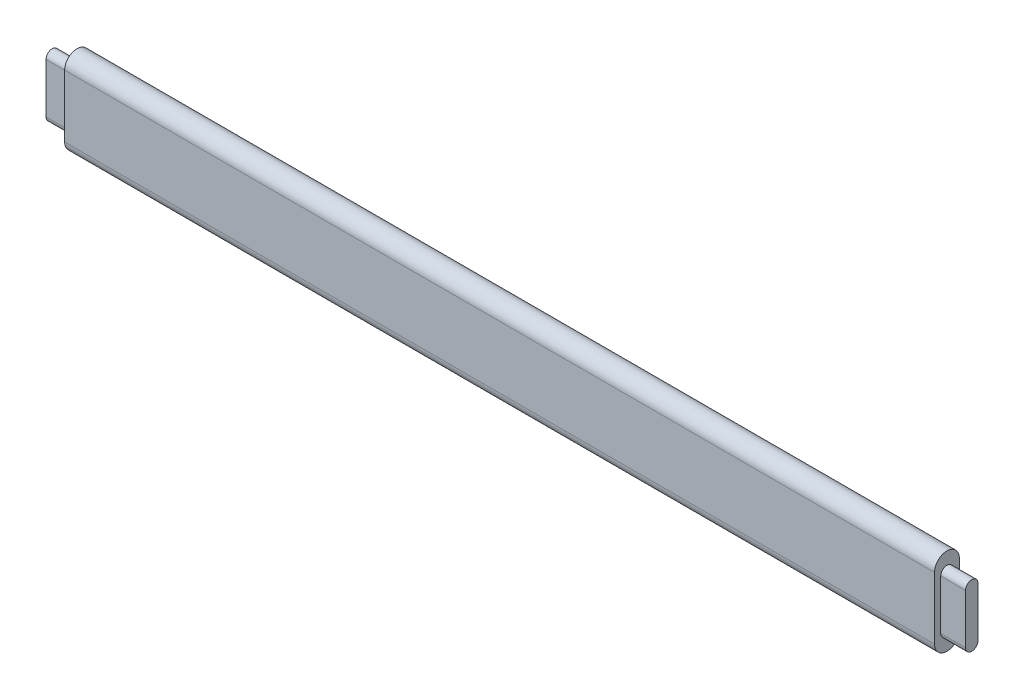
ISO-10303-21;
HEADER;
FILE_DESCRIPTION(('STEP AP214'),'2;1');
FILE_NAME('part.step','',(''),(''),'','','');
FILE_SCHEMA(('AUTOMOTIVE_DESIGN { 1 0 10303 214 1 1 1 1 }'));
ENDSEC;
DATA;
#1=APPLICATION_CONTEXT('core data for automotive mechanical design processes');
#2=APPLICATION_PROTOCOL_DEFINITION('international standard','automotive_design',2000,#1);
#3=PRODUCT_CONTEXT('',#1,'mechanical');
#4=PRODUCT('Part','Part','',(#3));
#5=PRODUCT_RELATED_PRODUCT_CATEGORY('part','',(#4));
#6=PRODUCT_DEFINITION_FORMATION('','',#4);
#7=PRODUCT_DEFINITION_CONTEXT('part definition',#1,'design');
#8=PRODUCT_DEFINITION('design','',#6,#7);
#9=PRODUCT_DEFINITION_SHAPE('','',#8);
#10=(LENGTH_UNIT() NAMED_UNIT(*) SI_UNIT(.MILLI.,.METRE.));
#11=(NAMED_UNIT(*) PLANE_ANGLE_UNIT() SI_UNIT($,.RADIAN.));
#12=(NAMED_UNIT(*) SI_UNIT($,.STERADIAN.) SOLID_ANGLE_UNIT());
#13=UNCERTAINTY_MEASURE_WITH_UNIT(LENGTH_MEASURE(1.E-05),#10,'distance_accuracy_value','');
#14=(GEOMETRIC_REPRESENTATION_CONTEXT(3) GLOBAL_UNCERTAINTY_ASSIGNED_CONTEXT((#13)) GLOBAL_UNIT_ASSIGNED_CONTEXT((#10,
#11,#12)) REPRESENTATION_CONTEXT('',''));
#15=CARTESIAN_POINT('',(0.,0.,0.));
#16=DIRECTION('',(0.,0.,1.));
#17=DIRECTION('',(1.,0.,0.));
#18=AXIS2_PLACEMENT_3D('',#15,#16,#17);
#19=CARTESIAN_POINT('',(444.5,31.75,0.));
#20=DIRECTION('',(-1.,0.,0.));
#21=DIRECTION('',(0.,0.,1.));
#22=AXIS2_PLACEMENT_3D('',#19,#20,#21);
#23=CYLINDRICAL_SURFACE('',#22,12.7);
#24=CARTESIAN_POINT('',(-444.5,31.75,0.));
#25=DIRECTION('',(1.,0.,0.));
#26=DIRECTION('',(0.,0.,-1.));
#27=AXIS2_PLACEMENT_3D('',#24,#25,#26);
#28=CIRCLE('',#27,12.7);
#29=CARTESIAN_POINT('',(-444.5,31.75,-12.7));
#30=VERTEX_POINT('',#29);
#31=CARTESIAN_POINT('',(-444.5,31.75,12.7));
#32=VERTEX_POINT('',#31);
#33=EDGE_CURVE('E188',#30,#32,#28,.T.);
#34=ORIENTED_EDGE('',*,*,#33,.T.);
#35=DIRECTION('',(-1.,0.,0.));
#36=VECTOR('',#35,1.);
#37=CARTESIAN_POINT('',(444.5,31.75,12.7));
#38=LINE('',#37,#36);
#39=CARTESIAN_POINT('',(444.5,31.75,12.7));
#40=VERTEX_POINT('',#39);
#41=EDGE_CURVE('E11',#40,#32,#38,.T.);
#42=ORIENTED_EDGE('',*,*,#41,.F.);
#43=CARTESIAN_POINT('',(444.5,31.75,0.));
#44=DIRECTION('',(1.,0.,0.));
#45=DIRECTION('',(0.,0.,-1.));
#46=AXIS2_PLACEMENT_3D('',#43,#44,#45);
#47=CIRCLE('',#46,12.7);
#48=CARTESIAN_POINT('',(444.5,31.75,-12.7));
#49=VERTEX_POINT('',#48);
#50=EDGE_CURVE('E189',#49,#40,#47,.T.);
#51=ORIENTED_EDGE('',*,*,#50,.F.);
#52=DIRECTION('',(-1.,0.,0.));
#53=VECTOR('',#52,1.);
#54=CARTESIAN_POINT('',(444.5,31.75,-12.7));
#55=LINE('',#54,#53);
#56=EDGE_CURVE('E199',#49,#30,#55,.T.);
#57=ORIENTED_EDGE('',*,*,#56,.T.);
#58=EDGE_LOOP('',(#34,#42,#51,#57));
#59=FACE_BOUND('',#58,.T.);
#60=ADVANCED_FACE('F32',(#59),#23,.T.);
#61=CARTESIAN_POINT('',(444.5,31.75,12.7));
#62=DIRECTION('',(0.,0.,-1.));
#63=DIRECTION('',(0.,1.,0.));
#64=AXIS2_PLACEMENT_3D('',#61,#62,#63);
#65=PLANE('',#64);
#66=DIRECTION('',(0.,-1.,0.));
#67=VECTOR('',#66,1.);
#68=CARTESIAN_POINT('',(-444.5,31.75,12.7));
#69=LINE('',#68,#67);
#70=CARTESIAN_POINT('',(-444.5,-31.75,12.7));
#71=VERTEX_POINT('',#70);
#72=EDGE_CURVE('E202',#32,#71,#69,.T.);
#73=ORIENTED_EDGE('',*,*,#72,.T.);
#74=DIRECTION('',(-1.,0.,0.));
#75=VECTOR('',#74,1.);
#76=CARTESIAN_POINT('',(444.5,-31.75,12.7));
#77=LINE('',#76,#75);
#78=CARTESIAN_POINT('',(444.5,-31.75,12.7));
#79=VERTEX_POINT('',#78);
#80=EDGE_CURVE('E39',#79,#71,#77,.T.);
#81=ORIENTED_EDGE('',*,*,#80,.F.);
#82=DIRECTION('',(0.,-1.,0.));
#83=VECTOR('',#82,1.);
#84=CARTESIAN_POINT('',(444.5,31.75,12.7));
#85=LINE('',#84,#83);
#86=EDGE_CURVE('E192',#40,#79,#85,.T.);
#87=ORIENTED_EDGE('',*,*,#86,.F.);
#88=ORIENTED_EDGE('',*,*,#41,.T.);
#89=EDGE_LOOP('',(#73,#81,#87,#88));
#90=FACE_BOUND('',#89,.T.);
#91=ADVANCED_FACE('F232',(#90),#65,.F.);
#92=CARTESIAN_POINT('',(444.5,-31.75,0.));
#93=DIRECTION('',(-1.,0.,0.));
#94=DIRECTION('',(0.,0.,1.));
#95=AXIS2_PLACEMENT_3D('',#92,#93,#94);
#96=CYLINDRICAL_SURFACE('',#95,12.7);
#97=CARTESIAN_POINT('',(-444.5,-31.75,0.));
#98=DIRECTION('',(1.,0.,0.));
#99=DIRECTION('',(0.,0.,-1.));
#100=AXIS2_PLACEMENT_3D('',#97,#98,#99);
#101=CIRCLE('',#100,12.7);
#102=CARTESIAN_POINT('',(-444.5,-31.75,-12.7));
#103=VERTEX_POINT('',#102);
#104=EDGE_CURVE('E204',#71,#103,#101,.T.);
#105=ORIENTED_EDGE('',*,*,#104,.T.);
#106=DIRECTION('',(-1.,0.,0.));
#107=VECTOR('',#106,1.);
#108=CARTESIAN_POINT('',(444.5,-31.75,-12.7));
#109=LINE('',#108,#107);
#110=CARTESIAN_POINT('',(444.5,-31.75,-12.7));
#111=VERTEX_POINT('',#110);
#112=EDGE_CURVE('E209',#111,#103,#109,.T.);
#113=ORIENTED_EDGE('',*,*,#112,.F.);
#114=CARTESIAN_POINT('',(444.5,-31.75,0.));
#115=DIRECTION('',(1.,0.,0.));
#116=DIRECTION('',(0.,0.,-1.));
#117=AXIS2_PLACEMENT_3D('',#114,#115,#116);
#118=CIRCLE('',#117,12.7);
#119=EDGE_CURVE('E195',#79,#111,#118,.T.);
#120=ORIENTED_EDGE('',*,*,#119,.F.);
#121=ORIENTED_EDGE('',*,*,#80,.T.);
#122=EDGE_LOOP('',(#105,#113,#120,#121));
#123=FACE_BOUND('',#122,.T.);
#124=ADVANCED_FACE('F216',(#123),#96,.T.);
#125=CARTESIAN_POINT('',(444.5,31.75,-12.7));
#126=DIRECTION('',(0.,0.,1.));
#127=DIRECTION('',(0.,-1.,0.));
#128=AXIS2_PLACEMENT_3D('',#125,#126,#127);
#129=PLANE('',#128);
#130=DIRECTION('',(0.,1.,0.));
#131=VECTOR('',#130,1.);
#132=CARTESIAN_POINT('',(-444.5,31.75,-12.7));
#133=LINE('',#132,#131);
#134=EDGE_CURVE('E193',#103,#30,#133,.T.);
#135=ORIENTED_EDGE('',*,*,#134,.T.);
#136=ORIENTED_EDGE('',*,*,#56,.F.);
#137=DIRECTION('',(0.,1.,0.));
#138=VECTOR('',#137,1.);
#139=CARTESIAN_POINT('',(444.5,31.75,-12.7));
#140=LINE('',#139,#138);
#141=EDGE_CURVE('E197',#111,#49,#140,.T.);
#142=ORIENTED_EDGE('',*,*,#141,.F.);
#143=ORIENTED_EDGE('',*,*,#112,.T.);
#144=EDGE_LOOP('',(#135,#136,#142,#143));
#145=FACE_BOUND('',#144,.T.);
#146=ADVANCED_FACE('F225',(#145),#129,.F.);
#147=CARTESIAN_POINT('',(444.5,31.75,0.));
#148=DIRECTION('',(1.,0.,0.));
#149=DIRECTION('',(0.,0.,-1.));
#150=AXIS2_PLACEMENT_3D('',#147,#148,#149);
#151=PLANE('',#150);
#152=CARTESIAN_POINT('',(444.5,-25.4,0.));
#153=DIRECTION('',(1.,0.,0.));
#154=DIRECTION('',(0.,0.,-1.));
#155=AXIS2_PLACEMENT_3D('',#152,#153,#154);
#156=CIRCLE('',#155,6.35);
#157=CARTESIAN_POINT('',(444.5,-25.4,6.35));
#158=VERTEX_POINT('',#157);
#159=CARTESIAN_POINT('',(444.5,-25.4,-6.35));
#160=VERTEX_POINT('',#159);
#161=EDGE_CURVE('E54',#158,#160,#156,.T.);
#162=ORIENTED_EDGE('',*,*,#161,.F.);
#163=DIRECTION('',(0.,-1.,0.));
#164=VECTOR('',#163,1.);
#165=CARTESIAN_POINT('',(444.5,-25.4,6.35));
#166=LINE('',#165,#164);
#167=CARTESIAN_POINT('',(444.5,25.4,6.35000000000001));
#168=VERTEX_POINT('',#167);
#169=EDGE_CURVE('E162',#168,#158,#166,.T.);
#170=ORIENTED_EDGE('',*,*,#169,.F.);
#171=CARTESIAN_POINT('',(444.5,25.4,0.));
#172=DIRECTION('',(1.,0.,0.));
#173=DIRECTION('',(0.,0.,-1.));
#174=AXIS2_PLACEMENT_3D('',#171,#172,#173);
#175=CIRCLE('',#174,6.35);
#176=CARTESIAN_POINT('',(444.5,25.4,-6.34999999999999));
#177=VERTEX_POINT('',#176);
#178=EDGE_CURVE('E173',#177,#168,#175,.T.);
#179=ORIENTED_EDGE('',*,*,#178,.F.);
#180=DIRECTION('',(0.,1.,0.));
#181=VECTOR('',#180,1.);
#182=CARTESIAN_POINT('',(444.5,-25.4,-6.35));
#183=LINE('',#182,#181);
#184=EDGE_CURVE('E170',#160,#177,#183,.T.);
#185=ORIENTED_EDGE('',*,*,#184,.F.);
#186=EDGE_LOOP('',(#162,#170,#179,#185));
#187=FACE_BOUND('',#186,.T.);
#188=ORIENTED_EDGE('',*,*,#50,.T.);
#189=ORIENTED_EDGE('',*,*,#86,.T.);
#190=ORIENTED_EDGE('',*,*,#119,.T.);
#191=ORIENTED_EDGE('',*,*,#141,.T.);
#192=EDGE_LOOP('',(#188,#189,#190,#191));
#193=FACE_BOUND('',#192,.T.);
#194=ADVANCED_FACE('F231',(#187,#193),#151,.T.);
#195=CARTESIAN_POINT('',(-444.5,31.75,0.));
#196=DIRECTION('',(1.,0.,0.));
#197=DIRECTION('',(0.,0.,-1.));
#198=AXIS2_PLACEMENT_3D('',#195,#196,#197);
#199=PLANE('',#198);
#200=DIRECTION('',(0.,-1.,0.));
#201=VECTOR('',#200,1.);
#202=CARTESIAN_POINT('',(-444.5,-25.4,6.35));
#203=LINE('',#202,#201);
#204=CARTESIAN_POINT('',(-444.5,25.4,6.35000000000001));
#205=VERTEX_POINT('',#204);
#206=CARTESIAN_POINT('',(-444.5,-25.4,6.35));
#207=VERTEX_POINT('',#206);
#208=EDGE_CURVE('E147',#205,#207,#203,.T.);
#209=ORIENTED_EDGE('',*,*,#208,.T.);
#210=CARTESIAN_POINT('',(-444.5,-25.4,0.));
#211=DIRECTION('',(1.,0.,0.));
#212=DIRECTION('',(0.,0.,-1.));
#213=AXIS2_PLACEMENT_3D('',#210,#211,#212);
#214=CIRCLE('',#213,6.35);
#215=CARTESIAN_POINT('',(-444.5,-25.4,-6.35));
#216=VERTEX_POINT('',#215);
#217=EDGE_CURVE('E46',#207,#216,#214,.T.);
#218=ORIENTED_EDGE('',*,*,#217,.T.);
#219=DIRECTION('',(0.,1.,0.));
#220=VECTOR('',#219,1.);
#221=CARTESIAN_POINT('',(-444.5,-25.4,-6.35));
#222=LINE('',#221,#220);
#223=CARTESIAN_POINT('',(-444.5,25.4,-6.34999999999999));
#224=VERTEX_POINT('',#223);
#225=EDGE_CURVE('E137',#216,#224,#222,.T.);
#226=ORIENTED_EDGE('',*,*,#225,.T.);
#227=CARTESIAN_POINT('',(-444.5,25.4,0.));
#228=DIRECTION('',(1.,0.,0.));
#229=DIRECTION('',(0.,0.,-1.));
#230=AXIS2_PLACEMENT_3D('',#227,#228,#229);
#231=CIRCLE('',#230,6.35);
#232=EDGE_CURVE('E149',#224,#205,#231,.T.);
#233=ORIENTED_EDGE('',*,*,#232,.T.);
#234=EDGE_LOOP('',(#209,#218,#226,#233));
#235=FACE_BOUND('',#234,.T.);
#236=ORIENTED_EDGE('',*,*,#33,.F.);
#237=ORIENTED_EDGE('',*,*,#134,.F.);
#238=ORIENTED_EDGE('',*,*,#104,.F.);
#239=ORIENTED_EDGE('',*,*,#72,.F.);
#240=EDGE_LOOP('',(#236,#237,#238,#239));
#241=FACE_BOUND('',#240,.T.);
#242=ADVANCED_FACE('F222',(#235,#241),#199,.F.);
#243=CARTESIAN_POINT('',(469.9,-25.4,0.));
#244=DIRECTION('',(-1.,0.,0.));
#245=DIRECTION('',(0.,0.,1.));
#246=AXIS2_PLACEMENT_3D('',#243,#244,#245);
#247=CYLINDRICAL_SURFACE('',#246,6.35);
#248=ORIENTED_EDGE('',*,*,#161,.T.);
#249=DIRECTION('',(-1.,0.,0.));
#250=VECTOR('',#249,1.);
#251=CARTESIAN_POINT('',(469.9,-25.4,-6.35));
#252=LINE('',#251,#250);
#253=CARTESIAN_POINT('',(469.9,-25.4,-6.35));
#254=VERTEX_POINT('',#253);
#255=EDGE_CURVE('E185',#254,#160,#252,.T.);
#256=ORIENTED_EDGE('',*,*,#255,.F.);
#257=CARTESIAN_POINT('',(469.9,-25.4,0.));
#258=DIRECTION('',(1.,0.,0.));
#259=DIRECTION('',(0.,0.,-1.));
#260=AXIS2_PLACEMENT_3D('',#257,#258,#259);
#261=CIRCLE('',#260,6.35);
#262=CARTESIAN_POINT('',(469.9,-25.4,6.35));
#263=VERTEX_POINT('',#262);
#264=EDGE_CURVE('E158',#263,#254,#261,.T.);
#265=ORIENTED_EDGE('',*,*,#264,.F.);
#266=DIRECTION('',(-1.,0.,0.));
#267=VECTOR('',#266,1.);
#268=CARTESIAN_POINT('',(469.9,-25.4,6.35));
#269=LINE('',#268,#267);
#270=EDGE_CURVE('E168',#263,#158,#269,.T.);
#271=ORIENTED_EDGE('',*,*,#270,.T.);
#272=EDGE_LOOP('',(#248,#256,#265,#271));
#273=FACE_BOUND('',#272,.T.);
#274=ADVANCED_FACE('F244',(#273),#247,.T.);
#275=CARTESIAN_POINT('',(469.9,-25.4,-6.35));
#276=DIRECTION('',(0.,0.,1.));
#277=DIRECTION('',(0.,-1.,0.));
#278=AXIS2_PLACEMENT_3D('',#275,#276,#277);
#279=PLANE('',#278);
#280=ORIENTED_EDGE('',*,*,#184,.T.);
#281=DIRECTION('',(-1.,0.,0.));
#282=VECTOR('',#281,1.);
#283=CARTESIAN_POINT('',(469.9,25.4,-6.34999999999999));
#284=LINE('',#283,#282);
#285=CARTESIAN_POINT('',(469.9,25.4,-6.34999999999999));
#286=VERTEX_POINT('',#285);
#287=EDGE_CURVE('E182',#286,#177,#284,.T.);
#288=ORIENTED_EDGE('',*,*,#287,.F.);
#289=DIRECTION('',(0.,1.,0.));
#290=VECTOR('',#289,1.);
#291=CARTESIAN_POINT('',(469.9,-25.4,-6.35));
#292=LINE('',#291,#290);
#293=EDGE_CURVE('E161',#254,#286,#292,.T.);
#294=ORIENTED_EDGE('',*,*,#293,.F.);
#295=ORIENTED_EDGE('',*,*,#255,.T.);
#296=EDGE_LOOP('',(#280,#288,#294,#295));
#297=FACE_BOUND('',#296,.T.);
#298=ADVANCED_FACE('F250',(#297),#279,.F.);
#299=CARTESIAN_POINT('',(469.9,25.4,0.));
#300=DIRECTION('',(-1.,0.,0.));
#301=DIRECTION('',(0.,0.,1.));
#302=AXIS2_PLACEMENT_3D('',#299,#300,#301);
#303=CYLINDRICAL_SURFACE('',#302,6.35);
#304=ORIENTED_EDGE('',*,*,#178,.T.);
#305=DIRECTION('',(-1.,0.,0.));
#306=VECTOR('',#305,1.);
#307=CARTESIAN_POINT('',(469.9,25.4,6.35000000000001));
#308=LINE('',#307,#306);
#309=CARTESIAN_POINT('',(469.9,25.4,6.35000000000001));
#310=VERTEX_POINT('',#309);
#311=EDGE_CURVE('E179',#310,#168,#308,.T.);
#312=ORIENTED_EDGE('',*,*,#311,.F.);
#313=CARTESIAN_POINT('',(469.9,25.4,0.));
#314=DIRECTION('',(1.,0.,0.));
#315=DIRECTION('',(0.,0.,-1.));
#316=AXIS2_PLACEMENT_3D('',#313,#314,#315);
#317=CIRCLE('',#316,6.35);
#318=EDGE_CURVE('E164',#286,#310,#317,.T.);
#319=ORIENTED_EDGE('',*,*,#318,.F.);
#320=ORIENTED_EDGE('',*,*,#287,.T.);
#321=EDGE_LOOP('',(#304,#312,#319,#320));
#322=FACE_BOUND('',#321,.T.);
#323=ADVANCED_FACE('F254',(#322),#303,.T.);
#324=CARTESIAN_POINT('',(469.9,-25.4,6.35));
#325=DIRECTION('',(0.,0.,-1.));
#326=DIRECTION('',(0.,1.,0.));
#327=AXIS2_PLACEMENT_3D('',#324,#325,#326);
#328=PLANE('',#327);
#329=ORIENTED_EDGE('',*,*,#169,.T.);
#330=ORIENTED_EDGE('',*,*,#270,.F.);
#331=DIRECTION('',(0.,-1.,0.));
#332=VECTOR('',#331,1.);
#333=CARTESIAN_POINT('',(469.9,-25.4,6.35));
#334=LINE('',#333,#332);
#335=EDGE_CURVE('E166',#310,#263,#334,.T.);
#336=ORIENTED_EDGE('',*,*,#335,.F.);
#337=ORIENTED_EDGE('',*,*,#311,.T.);
#338=EDGE_LOOP('',(#329,#330,#336,#337));
#339=FACE_BOUND('',#338,.T.);
#340=ADVANCED_FACE('F258',(#339),#328,.F.);
#341=CARTESIAN_POINT('',(469.9,-25.4,0.));
#342=DIRECTION('',(1.,0.,0.));
#343=DIRECTION('',(0.,0.,-1.));
#344=AXIS2_PLACEMENT_3D('',#341,#342,#343);
#345=PLANE('',#344);
#346=ORIENTED_EDGE('',*,*,#264,.T.);
#347=ORIENTED_EDGE('',*,*,#293,.T.);
#348=ORIENTED_EDGE('',*,*,#318,.T.);
#349=ORIENTED_EDGE('',*,*,#335,.T.);
#350=EDGE_LOOP('',(#346,#347,#348,#349));
#351=FACE_BOUND('',#350,.T.);
#352=ADVANCED_FACE('F262',(#351),#345,.T.);
#353=CARTESIAN_POINT('',(-469.9,-25.4,0.));
#354=DIRECTION('',(1.,0.,0.));
#355=DIRECTION('',(0.,0.,-1.));
#356=AXIS2_PLACEMENT_3D('',#353,#354,#355);
#357=CYLINDRICAL_SURFACE('',#356,6.35);
#358=ORIENTED_EDGE('',*,*,#217,.F.);
#359=DIRECTION('',(1.,0.,0.));
#360=VECTOR('',#359,1.);
#361=CARTESIAN_POINT('',(-469.9,-25.4,6.35));
#362=LINE('',#361,#360);
#363=CARTESIAN_POINT('',(-469.9,-25.4,6.35));
#364=VERTEX_POINT('',#363);
#365=EDGE_CURVE('E118',#364,#207,#362,.T.);
#366=ORIENTED_EDGE('',*,*,#365,.F.);
#367=CARTESIAN_POINT('',(-469.9,-25.4,0.));
#368=DIRECTION('',(1.,0.,0.));
#369=DIRECTION('',(0.,0.,-1.));
#370=AXIS2_PLACEMENT_3D('',#367,#368,#369);
#371=CIRCLE('',#370,6.35);
#372=CARTESIAN_POINT('',(-469.9,-25.4,-6.35));
#373=VERTEX_POINT('',#372);
#374=EDGE_CURVE('E121',#364,#373,#371,.T.);
#375=ORIENTED_EDGE('',*,*,#374,.T.);
#376=DIRECTION('',(1.,0.,0.));
#377=VECTOR('',#376,1.);
#378=CARTESIAN_POINT('',(-469.9,-25.4,-6.35));
#379=LINE('',#378,#377);
#380=EDGE_CURVE('E145',#373,#216,#379,.T.);
#381=ORIENTED_EDGE('',*,*,#380,.T.);
#382=EDGE_LOOP('',(#358,#366,#375,#381));
#383=FACE_BOUND('',#382,.T.);
#384=ADVANCED_FACE('F120',(#383),#357,.T.);
#385=CARTESIAN_POINT('',(-469.9,-25.4,6.35));
#386=DIRECTION('',(0.,0.,1.));
#387=DIRECTION('',(0.,-1.,0.));
#388=AXIS2_PLACEMENT_3D('',#385,#386,#387);
#389=PLANE('',#388);
#390=ORIENTED_EDGE('',*,*,#208,.F.);
#391=DIRECTION('',(1.,0.,0.));
#392=VECTOR('',#391,1.);
#393=CARTESIAN_POINT('',(-469.9,25.4,6.35000000000001));
#394=LINE('',#393,#392);
#395=CARTESIAN_POINT('',(-469.9,25.4,6.35000000000001));
#396=VERTEX_POINT('',#395);
#397=EDGE_CURVE('E127',#396,#205,#394,.T.);
#398=ORIENTED_EDGE('',*,*,#397,.F.);
#399=DIRECTION('',(0.,-1.,0.));
#400=VECTOR('',#399,1.);
#401=CARTESIAN_POINT('',(-469.9,-25.4,6.35));
#402=LINE('',#401,#400);
#403=EDGE_CURVE('E133',#396,#364,#402,.T.);
#404=ORIENTED_EDGE('',*,*,#403,.T.);
#405=ORIENTED_EDGE('',*,*,#365,.T.);
#406=EDGE_LOOP('',(#390,#398,#404,#405));
#407=FACE_BOUND('',#406,.T.);
#408=ADVANCED_FACE('F139',(#407),#389,.T.);
#409=CARTESIAN_POINT('',(-469.9,25.4,0.));
#410=DIRECTION('',(1.,0.,0.));
#411=DIRECTION('',(0.,0.,-1.));
#412=AXIS2_PLACEMENT_3D('',#409,#410,#411);
#413=CYLINDRICAL_SURFACE('',#412,6.35);
#414=ORIENTED_EDGE('',*,*,#232,.F.);
#415=DIRECTION('',(1.,0.,0.));
#416=VECTOR('',#415,1.);
#417=CARTESIAN_POINT('',(-469.9,25.4,-6.34999999999999));
#418=LINE('',#417,#416);
#419=CARTESIAN_POINT('',(-469.9,25.4,-6.34999999999999));
#420=VERTEX_POINT('',#419);
#421=EDGE_CURVE('E155',#420,#224,#418,.T.);
#422=ORIENTED_EDGE('',*,*,#421,.F.);
#423=CARTESIAN_POINT('',(-469.9,25.4,0.));
#424=DIRECTION('',(1.,0.,0.));
#425=DIRECTION('',(0.,0.,-1.));
#426=AXIS2_PLACEMENT_3D('',#423,#424,#425);
#427=CIRCLE('',#426,6.35);
#428=EDGE_CURVE('E140',#420,#396,#427,.T.);
#429=ORIENTED_EDGE('',*,*,#428,.T.);
#430=ORIENTED_EDGE('',*,*,#397,.T.);
#431=EDGE_LOOP('',(#414,#422,#429,#430));
#432=FACE_BOUND('',#431,.T.);
#433=ADVANCED_FACE('F271',(#432),#413,.T.);
#434=CARTESIAN_POINT('',(-469.9,-25.4,-6.35));
#435=DIRECTION('',(0.,0.,-1.));
#436=DIRECTION('',(0.,1.,0.));
#437=AXIS2_PLACEMENT_3D('',#434,#435,#436);
#438=PLANE('',#437);
#439=ORIENTED_EDGE('',*,*,#225,.F.);
#440=ORIENTED_EDGE('',*,*,#380,.F.);
#441=DIRECTION('',(0.,1.,0.));
#442=VECTOR('',#441,1.);
#443=CARTESIAN_POINT('',(-469.9,-25.4,-6.35));
#444=LINE('',#443,#442);
#445=EDGE_CURVE('E136',#373,#420,#444,.T.);
#446=ORIENTED_EDGE('',*,*,#445,.T.);
#447=ORIENTED_EDGE('',*,*,#421,.T.);
#448=EDGE_LOOP('',(#439,#440,#446,#447));
#449=FACE_BOUND('',#448,.T.);
#450=ADVANCED_FACE('F274',(#449),#438,.T.);
#451=CARTESIAN_POINT('',(-469.9,-25.4,0.));
#452=DIRECTION('',(-1.,0.,0.));
#453=DIRECTION('',(0.,0.,-1.));
#454=AXIS2_PLACEMENT_3D('',#451,#452,#453);
#455=PLANE('',#454);
#456=ORIENTED_EDGE('',*,*,#374,.F.);
#457=ORIENTED_EDGE('',*,*,#403,.F.);
#458=ORIENTED_EDGE('',*,*,#428,.F.);
#459=ORIENTED_EDGE('',*,*,#445,.F.);
#460=EDGE_LOOP('',(#456,#457,#458,#459));
#461=FACE_BOUND('',#460,.T.);
#462=ADVANCED_FACE('F131',(#461),#455,.T.);
#463=CLOSED_SHELL('',(#60,#91,#124,#146,#194,#242,#274,#298,#323,#340,#352,#384,#408,#433,#450,#462));
#464=MANIFOLD_SOLID_BREP('B2',#463);
#465=ADVANCED_BREP_SHAPE_REPRESENTATION('',(#18,#464),#14);
#466=SHAPE_DEFINITION_REPRESENTATION(#9,#465);
ENDSEC;
END-ISO-10303-21;
